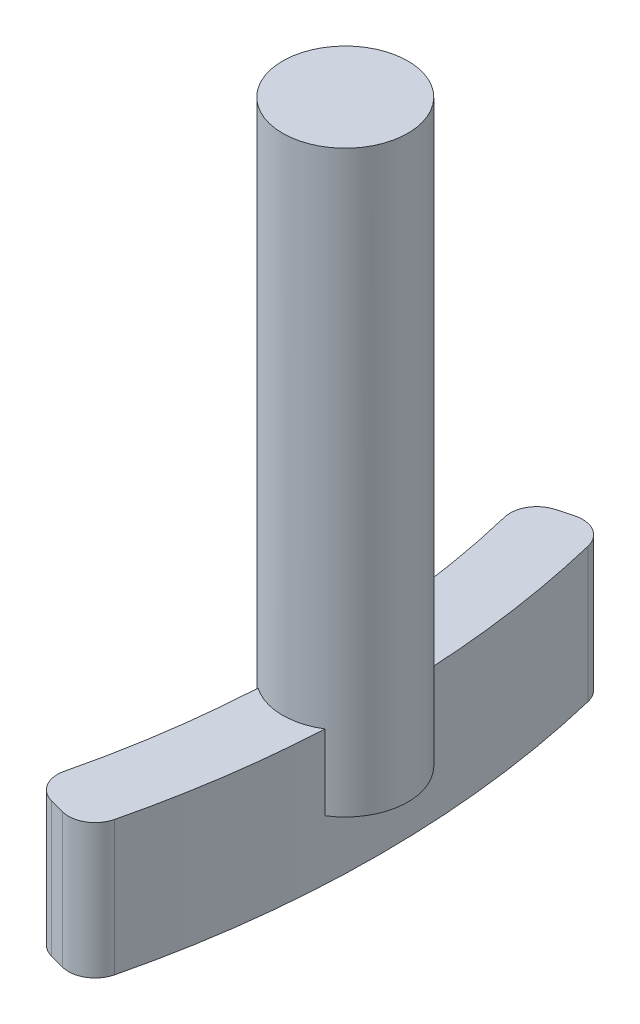
ISO-10303-21;
HEADER;
FILE_DESCRIPTION(('STEP AP214'),'2;1');
FILE_NAME('part.step','',(''),(''),'','','');
FILE_SCHEMA(('AUTOMOTIVE_DESIGN { 1 0 10303 214 1 1 1 1 }'));
ENDSEC;
DATA;
#1=APPLICATION_CONTEXT('core data for automotive mechanical design processes');
#2=APPLICATION_PROTOCOL_DEFINITION('international standard','automotive_design',2000,#1);
#3=PRODUCT_CONTEXT('',#1,'mechanical');
#4=PRODUCT('Part','Part','',(#3));
#5=PRODUCT_RELATED_PRODUCT_CATEGORY('part','',(#4));
#6=PRODUCT_DEFINITION_FORMATION('','',#4);
#7=PRODUCT_DEFINITION_CONTEXT('part definition',#1,'design');
#8=PRODUCT_DEFINITION('design','',#6,#7);
#9=PRODUCT_DEFINITION_SHAPE('','',#8);
#10=(LENGTH_UNIT() NAMED_UNIT(*) SI_UNIT(.MILLI.,.METRE.));
#11=(NAMED_UNIT(*) PLANE_ANGLE_UNIT() SI_UNIT($,.RADIAN.));
#12=(NAMED_UNIT(*) SI_UNIT($,.STERADIAN.) SOLID_ANGLE_UNIT());
#13=UNCERTAINTY_MEASURE_WITH_UNIT(LENGTH_MEASURE(1.E-05),#10,'distance_accuracy_value','');
#14=(GEOMETRIC_REPRESENTATION_CONTEXT(3) GLOBAL_UNCERTAINTY_ASSIGNED_CONTEXT((#13)) GLOBAL_UNIT_ASSIGNED_CONTEXT((#10,
#11,#12)) REPRESENTATION_CONTEXT('',''));
#15=CARTESIAN_POINT('',(0.,0.,0.));
#16=DIRECTION('',(0.,0.,1.));
#17=DIRECTION('',(1.,0.,0.));
#18=AXIS2_PLACEMENT_3D('',#15,#16,#17);
#19=CARTESIAN_POINT('',(-30.5687487202427,4.3,-6.82173660494919E-13));
#20=DIRECTION('',(0.,-1.,0.));
#21=DIRECTION('',(0.,0.,-1.));
#22=AXIS2_PLACEMENT_3D('',#19,#20,#21);
#23=CYLINDRICAL_SURFACE('',#22,32.0999999999997);
#24=DIRECTION('',(0.,-1.,0.));
#25=VECTOR('',#24,1.);
#26=CARTESIAN_POINT('',(1.48625127975695,11.15,1.69911006117922));
#27=LINE('',#26,#25);
#28=CARTESIAN_POINT('',(1.4862512797569,4.3,1.69911006117915));
#29=VERTEX_POINT('',#28);
#30=CARTESIAN_POINT('',(1.48625127975689,1.9,1.69911006117926));
#31=VERTEX_POINT('',#30);
#32=EDGE_CURVE('E201',#29,#31,#27,.T.);
#33=ORIENTED_EDGE('',*,*,#32,.F.);
#34=CARTESIAN_POINT('',(-30.5687487202427,4.3,-6.82173660494919E-13));
#35=DIRECTION('',(0.,1.,0.));
#36=DIRECTION('',(0.,0.,1.));
#37=AXIS2_PLACEMENT_3D('',#34,#35,#36);
#38=CIRCLE('',#37,32.0999999999997);
#39=CARTESIAN_POINT('',(0.627933418644134,4.3,7.56154901625497));
#40=VERTEX_POINT('',#39);
#41=EDGE_CURVE('E190',#40,#29,#38,.T.);
#42=ORIENTED_EDGE('',*,*,#41,.F.);
#43=DIRECTION('',(0.,-1.,0.));
#44=VECTOR('',#43,1.);
#45=CARTESIAN_POINT('',(0.627933418644134,4.3,7.56154901625497));
#46=LINE('',#45,#44);
#47=CARTESIAN_POINT('',(0.627933418644134,0.,7.56154901625497));
#48=VERTEX_POINT('',#47);
#49=EDGE_CURVE('E151',#40,#48,#46,.T.);
#50=ORIENTED_EDGE('',*,*,#49,.T.);
#51=CARTESIAN_POINT('',(-30.5687487202427,0.,-6.82173660494919E-13));
#52=DIRECTION('',(0.,1.,0.));
#53=DIRECTION('',(0.,0.,1.));
#54=AXIS2_PLACEMENT_3D('',#51,#52,#53);
#55=CIRCLE('',#54,32.0999999999997);
#56=CARTESIAN_POINT('',(0.627933418643905,0.,-7.56154901625722));
#57=VERTEX_POINT('',#56);
#58=EDGE_CURVE('E176',#48,#57,#55,.T.);
#59=ORIENTED_EDGE('',*,*,#58,.T.);
#60=DIRECTION('',(0.,-1.,0.));
#61=VECTOR('',#60,1.);
#62=CARTESIAN_POINT('',(0.627933418643905,4.3,-7.56154901625722));
#63=LINE('',#62,#61);
#64=CARTESIAN_POINT('',(0.627933418643905,4.3,-7.56154901625722));
#65=VERTEX_POINT('',#64);
#66=EDGE_CURVE('E154',#65,#57,#63,.T.);
#67=ORIENTED_EDGE('',*,*,#66,.F.);
#68=CARTESIAN_POINT('',(1.48625127975698,4.3,-1.6991100611791));
#69=VERTEX_POINT('',#68);
#70=EDGE_CURVE('E193',#69,#65,#38,.T.);
#71=ORIENTED_EDGE('',*,*,#70,.F.);
#72=DIRECTION('',(0.,-1.,0.));
#73=VECTOR('',#72,1.);
#74=CARTESIAN_POINT('',(1.48625127975702,11.15,-1.69911006117918));
#75=LINE('',#74,#73);
#76=CARTESIAN_POINT('',(1.48625127975697,1.9,-1.69911006117921));
#77=VERTEX_POINT('',#76);
#78=EDGE_CURVE('E48',#77,#69,#75,.F.);
#79=ORIENTED_EDGE('',*,*,#78,.F.);
#80=CARTESIAN_POINT('',(-30.5687487202427,1.9,-6.82173660494919E-13));
#81=DIRECTION('',(0.,1.,0.));
#82=DIRECTION('',(0.,0.,1.));
#83=AXIS2_PLACEMENT_3D('',#80,#81,#82);
#84=CIRCLE('',#83,32.0999999999997);
#85=EDGE_CURVE('E52',#31,#77,#84,.T.);
#86=ORIENTED_EDGE('',*,*,#85,.F.);
#87=EDGE_LOOP('',(#33,#42,#50,#59,#67,#71,#79,#86));
#88=FACE_BOUND('',#87,.T.);
#89=ADVANCED_FACE('F33',(#88),#23,.T.);
#90=CARTESIAN_POINT('',(-30.5687487202427,4.3,-6.82173660494919E-13));
#91=DIRECTION('',(0.,-1.,0.));
#92=DIRECTION('',(0.,0.,-1.));
#93=AXIS2_PLACEMENT_3D('',#90,#91,#92);
#94=CYLINDRICAL_SURFACE('',#93,29.8999999999998);
#95=DIRECTION('',(0.,-1.,0.));
#96=VECTOR('',#95,1.);
#97=CARTESIAN_POINT('',(-0.713748720242946,11.15,1.63980944014838));
#98=LINE('',#97,#96);
#99=CARTESIAN_POINT('',(-0.713748720242945,1.9,1.63980944014838));
#100=VERTEX_POINT('',#99);
#101=CARTESIAN_POINT('',(-0.713748720242945,4.3,1.63980944014838));
#102=VERTEX_POINT('',#101);
#103=EDGE_CURVE('E203',#100,#102,#98,.F.);
#104=ORIENTED_EDGE('',*,*,#103,.F.);
#105=CARTESIAN_POINT('',(-30.5687487202427,1.9,-6.82173660494919E-13));
#106=DIRECTION('',(0.,1.,0.));
#107=DIRECTION('',(0.,0.,1.));
#108=AXIS2_PLACEMENT_3D('',#105,#106,#107);
#109=CIRCLE('',#108,29.8999999999998);
#110=CARTESIAN_POINT('',(-0.713748720242873,1.9,-1.63980944014843));
#111=VERTEX_POINT('',#110);
#112=EDGE_CURVE('E11',#111,#100,#109,.F.);
#113=ORIENTED_EDGE('',*,*,#112,.F.);
#114=DIRECTION('',(0.,-1.,0.));
#115=VECTOR('',#114,1.);
#116=CARTESIAN_POINT('',(-0.713748720242871,11.15,-1.63980944014843));
#117=LINE('',#116,#115);
#118=CARTESIAN_POINT('',(-0.713748720242869,4.3,-1.63980944014843));
#119=VERTEX_POINT('',#118);
#120=EDGE_CURVE('E134',#119,#111,#117,.T.);
#121=ORIENTED_EDGE('',*,*,#120,.F.);
#122=CARTESIAN_POINT('',(-30.5687487202427,4.3,-6.82173660494919E-13));
#123=DIRECTION('',(0.,-1.,0.));
#124=DIRECTION('',(0.,0.,1.));
#125=AXIS2_PLACEMENT_3D('',#122,#123,#124);
#126=CIRCLE('',#125,29.8999999999998);
#127=CARTESIAN_POINT('',(-1.50740974559166,4.3,-7.03196821668193));
#128=VERTEX_POINT('',#127);
#129=EDGE_CURVE('E120',#128,#119,#126,.T.);
#130=ORIENTED_EDGE('',*,*,#129,.F.);
#131=DIRECTION('',(0.,-1.,0.));
#132=VECTOR('',#131,1.);
#133=CARTESIAN_POINT('',(-1.50740974559166,4.3,-7.03196821668193));
#134=LINE('',#133,#132);
#135=CARTESIAN_POINT('',(-1.50740974559166,0.,-7.03196821668193));
#136=VERTEX_POINT('',#135);
#137=EDGE_CURVE('E163',#128,#136,#134,.T.);
#138=ORIENTED_EDGE('',*,*,#137,.T.);
#139=CARTESIAN_POINT('',(-30.5687487202427,0.,-6.82173660494919E-13));
#140=DIRECTION('',(0.,-1.,0.));
#141=DIRECTION('',(0.,0.,1.));
#142=AXIS2_PLACEMENT_3D('',#139,#140,#141);
#143=CIRCLE('',#142,29.8999999999998);
#144=CARTESIAN_POINT('',(-1.50740974559173,0.,7.03196821668091));
#145=VERTEX_POINT('',#144);
#146=EDGE_CURVE('E167',#136,#145,#143,.T.);
#147=ORIENTED_EDGE('',*,*,#146,.T.);
#148=DIRECTION('',(0.,-1.,0.));
#149=VECTOR('',#148,1.);
#150=CARTESIAN_POINT('',(-1.50740974559173,4.3,7.03196821668091));
#151=LINE('',#150,#149);
#152=CARTESIAN_POINT('',(-1.50740974559173,4.3,7.03196821668091));
#153=VERTEX_POINT('',#152);
#154=EDGE_CURVE('E130',#153,#145,#151,.T.);
#155=ORIENTED_EDGE('',*,*,#154,.F.);
#156=EDGE_CURVE('E131',#102,#153,#126,.T.);
#157=ORIENTED_EDGE('',*,*,#156,.F.);
#158=EDGE_LOOP('',(#104,#113,#121,#130,#138,#147,#155,#157));
#159=FACE_BOUND('',#158,.T.);
#160=ADVANCED_FACE('F135',(#159),#94,.F.);
#161=CARTESIAN_POINT('',(-0.681251279757298,4.3,7.23187366765677));
#162=DIRECTION('',(0.,-1.,0.));
#163=DIRECTION('',(0.,0.,-1.));
#164=AXIS2_PLACEMENT_3D('',#161,#162,#163);
#165=PLANE('',#164);
#166=CARTESIAN_POINT('',(0.431251279757166,4.3,0.));
#167=DIRECTION('',(0.,-1.,0.));
#168=DIRECTION('',(0.,0.,-1.));
#169=AXIS2_PLACEMENT_3D('',#166,#167,#168);
#170=CIRCLE('',#169,2.);
#171=EDGE_CURVE('E41',#102,#29,#170,.F.);
#172=ORIENTED_EDGE('',*,*,#171,.F.);
#173=ORIENTED_EDGE('',*,*,#156,.T.);
#174=CARTESIAN_POINT('',(-0.681251279757298,4.3,7.23187366765677));
#175=DIRECTION('',(0.,1.,0.));
#176=DIRECTION('',(0.,0.,-1.));
#177=AXIS2_PLACEMENT_3D('',#174,#175,#176);
#178=CIRCLE('',#177,0.849999999999792);
#179=CARTESIAN_POINT('',(-0.901247468094085,4.3,8.0529106200023));
#180=VERTEX_POINT('',#179);
#181=EDGE_CURVE('E169',#153,#180,#178,.T.);
#182=ORIENTED_EDGE('',*,*,#181,.T.);
#183=DIRECTION('',(0.965925826289131,0.,0.258819045102288));
#184=VECTOR('',#183,1.);
#185=CARTESIAN_POINT('',(-0.901247468094085,4.3,8.0529106200023));
#186=LINE('',#185,#184);
#187=CARTESIAN_POINT('',(-0.418143137857351,4.3,8.18235803514908));
#188=VERTEX_POINT('',#187);
#189=EDGE_CURVE('E196',#180,#188,#186,.T.);
#190=ORIENTED_EDGE('',*,*,#189,.T.);
#191=CARTESIAN_POINT('',(-0.198146949520289,4.3,7.36132108280253));
#192=DIRECTION('',(0.,1.,0.));
#193=DIRECTION('',(0.,0.,-1.));
#194=AXIS2_PLACEMENT_3D('',#191,#192,#193);
#195=CIRCLE('',#194,0.850000000000766);
#196=EDGE_CURVE('E194',#188,#40,#195,.T.);
#197=ORIENTED_EDGE('',*,*,#196,.T.);
#198=ORIENTED_EDGE('',*,*,#41,.T.);
#199=EDGE_LOOP('',(#172,#173,#182,#190,#197,#198));
#200=FACE_BOUND('',#199,.T.);
#201=ADVANCED_FACE('F232',(#200),#165,.F.);
#202=CARTESIAN_POINT('',(-0.681251279757298,4.3,7.23187366765677));
#203=DIRECTION('',(0.,-1.,0.));
#204=DIRECTION('',(0.,0.,-1.));
#205=AXIS2_PLACEMENT_3D('',#202,#203,#204);
#206=CYLINDRICAL_SURFACE('',#205,0.849999999999792);
#207=CARTESIAN_POINT('',(-0.681251279757298,0.,7.23187366765677));
#208=DIRECTION('',(0.,1.,0.));
#209=DIRECTION('',(0.,0.,-1.));
#210=AXIS2_PLACEMENT_3D('',#207,#208,#209);
#211=CIRCLE('',#210,0.849999999999792);
#212=CARTESIAN_POINT('',(-0.901247468094085,0.,8.0529106200023));
#213=VERTEX_POINT('',#212);
#214=EDGE_CURVE('E182',#145,#213,#211,.T.);
#215=ORIENTED_EDGE('',*,*,#214,.T.);
#216=DIRECTION('',(0.,-1.,0.));
#217=VECTOR('',#216,1.);
#218=CARTESIAN_POINT('',(-0.901247468094085,4.3,8.0529106200023));
#219=LINE('',#218,#217);
#220=EDGE_CURVE('E144',#180,#213,#219,.T.);
#221=ORIENTED_EDGE('',*,*,#220,.F.);
#222=ORIENTED_EDGE('',*,*,#181,.F.);
#223=ORIENTED_EDGE('',*,*,#154,.T.);
#224=EDGE_LOOP('',(#215,#221,#222,#223));
#225=FACE_BOUND('',#224,.T.);
#226=ADVANCED_FACE('F35',(#225),#206,.T.);
#227=CARTESIAN_POINT('',(-0.901247468094085,4.3,8.0529106200023));
#228=DIRECTION('',(0.258819045102288,0.,-0.965925826289131));
#229=DIRECTION('',(-0.965925826289131,0.,-0.258819045102288));
#230=AXIS2_PLACEMENT_3D('',#227,#228,#229);
#231=PLANE('',#230);
#232=DIRECTION('',(0.965925826289131,0.,0.258819045102288));
#233=VECTOR('',#232,1.);
#234=CARTESIAN_POINT('',(-0.901247468094085,0.,8.0529106200023));
#235=LINE('',#234,#233);
#236=CARTESIAN_POINT('',(-0.418143137857351,0.,8.18235803514908));
#237=VERTEX_POINT('',#236);
#238=EDGE_CURVE('E180',#213,#237,#235,.T.);
#239=ORIENTED_EDGE('',*,*,#238,.T.);
#240=DIRECTION('',(0.,-1.,0.));
#241=VECTOR('',#240,1.);
#242=CARTESIAN_POINT('',(-0.418143137857351,4.3,8.18235803514908));
#243=LINE('',#242,#241);
#244=EDGE_CURVE('E146',#188,#237,#243,.T.);
#245=ORIENTED_EDGE('',*,*,#244,.F.);
#246=ORIENTED_EDGE('',*,*,#189,.F.);
#247=ORIENTED_EDGE('',*,*,#220,.T.);
#248=EDGE_LOOP('',(#239,#245,#246,#247));
#249=FACE_BOUND('',#248,.T.);
#250=ADVANCED_FACE('F240',(#249),#231,.F.);
#251=CARTESIAN_POINT('',(-0.198146949520289,4.3,7.36132108280253));
#252=DIRECTION('',(0.,-1.,0.));
#253=DIRECTION('',(0.,0.,-1.));
#254=AXIS2_PLACEMENT_3D('',#251,#252,#253);
#255=CYLINDRICAL_SURFACE('',#254,0.850000000000766);
#256=CARTESIAN_POINT('',(-0.198146949520289,0.,7.36132108280253));
#257=DIRECTION('',(0.,1.,0.));
#258=DIRECTION('',(0.,0.,-1.));
#259=AXIS2_PLACEMENT_3D('',#256,#257,#258);
#260=CIRCLE('',#259,0.850000000000766);
#261=EDGE_CURVE('E178',#237,#48,#260,.T.);
#262=ORIENTED_EDGE('',*,*,#261,.T.);
#263=ORIENTED_EDGE('',*,*,#49,.F.);
#264=ORIENTED_EDGE('',*,*,#196,.F.);
#265=ORIENTED_EDGE('',*,*,#244,.T.);
#266=EDGE_LOOP('',(#262,#263,#264,#265));
#267=FACE_BOUND('',#266,.T.);
#268=ADVANCED_FACE('F238',(#267),#255,.T.);
#269=CARTESIAN_POINT('',(-0.198146949519636,4.3,-7.36132108280495));
#270=DIRECTION('',(0.,-1.,0.));
#271=DIRECTION('',(0.,0.,-1.));
#272=AXIS2_PLACEMENT_3D('',#269,#270,#271);
#273=CYLINDRICAL_SURFACE('',#272,0.8499999999999);
#274=CARTESIAN_POINT('',(-0.198146949519636,0.,-7.36132108280495));
#275=DIRECTION('',(0.,1.,0.));
#276=DIRECTION('',(0.,0.,-1.));
#277=AXIS2_PLACEMENT_3D('',#274,#275,#276);
#278=CIRCLE('',#277,0.8499999999999);
#279=CARTESIAN_POINT('',(-0.418143137856753,0.,-8.18235803515056));
#280=VERTEX_POINT('',#279);
#281=EDGE_CURVE('E174',#57,#280,#278,.T.);
#282=ORIENTED_EDGE('',*,*,#281,.T.);
#283=DIRECTION('',(0.,-1.,0.));
#284=VECTOR('',#283,1.);
#285=CARTESIAN_POINT('',(-0.418143137856753,4.3,-8.18235803515056));
#286=LINE('',#285,#284);
#287=CARTESIAN_POINT('',(-0.418143137856753,4.3,-8.18235803515056));
#288=VERTEX_POINT('',#287);
#289=EDGE_CURVE('E157',#288,#280,#286,.T.);
#290=ORIENTED_EDGE('',*,*,#289,.F.);
#291=CARTESIAN_POINT('',(-0.198146949519636,4.3,-7.36132108280495));
#292=DIRECTION('',(0.,1.,0.));
#293=DIRECTION('',(0.,0.,-1.));
#294=AXIS2_PLACEMENT_3D('',#291,#292,#293);
#295=CIRCLE('',#294,0.8499999999999);
#296=EDGE_CURVE('E188',#65,#288,#295,.T.);
#297=ORIENTED_EDGE('',*,*,#296,.F.);
#298=ORIENTED_EDGE('',*,*,#66,.T.);
#299=EDGE_LOOP('',(#282,#290,#297,#298));
#300=FACE_BOUND('',#299,.T.);
#301=ADVANCED_FACE('F236',(#300),#273,.T.);
#302=CARTESIAN_POINT('',(-0.901247468094234,4.3,-8.05291062000355));
#303=DIRECTION('',(0.258819045102377,0.,0.965925826289107));
#304=DIRECTION('',(0.965925826289107,0.,-0.258819045102377));
#305=AXIS2_PLACEMENT_3D('',#302,#303,#304);
#306=PLANE('',#305);
#307=DIRECTION('',(-0.965925826289107,0.,0.258819045102377));
#308=VECTOR('',#307,1.);
#309=CARTESIAN_POINT('',(-0.901247468094234,0.,-8.05291062000355));
#310=LINE('',#309,#308);
#311=CARTESIAN_POINT('',(-0.901247468094234,0.,-8.05291062000355));
#312=VERTEX_POINT('',#311);
#313=EDGE_CURVE('E172',#280,#312,#310,.T.);
#314=ORIENTED_EDGE('',*,*,#313,.T.);
#315=DIRECTION('',(0.,-1.,0.));
#316=VECTOR('',#315,1.);
#317=CARTESIAN_POINT('',(-0.901247468094234,4.3,-8.05291062000355));
#318=LINE('',#317,#316);
#319=CARTESIAN_POINT('',(-0.901247468094234,4.3,-8.05291062000355));
#320=VERTEX_POINT('',#319);
#321=EDGE_CURVE('E160',#320,#312,#318,.T.);
#322=ORIENTED_EDGE('',*,*,#321,.F.);
#323=DIRECTION('',(-0.965925826289107,0.,0.258819045102377));
#324=VECTOR('',#323,1.);
#325=CARTESIAN_POINT('',(-0.901247468094234,4.3,-8.05291062000355));
#326=LINE('',#325,#324);
#327=EDGE_CURVE('E186',#288,#320,#326,.T.);
#328=ORIENTED_EDGE('',*,*,#327,.F.);
#329=ORIENTED_EDGE('',*,*,#289,.T.);
#330=EDGE_LOOP('',(#314,#322,#328,#329));
#331=FACE_BOUND('',#330,.T.);
#332=ADVANCED_FACE('F267',(#331),#306,.F.);
#333=CARTESIAN_POINT('',(-0.681251279757095,4.3,-7.23187366765784));
#334=DIRECTION('',(0.,-1.,0.));
#335=DIRECTION('',(0.,0.,-1.));
#336=AXIS2_PLACEMENT_3D('',#333,#334,#335);
#337=CYLINDRICAL_SURFACE('',#336,0.850000000000002);
#338=CARTESIAN_POINT('',(-0.681251279757095,0.,-7.23187366765784));
#339=DIRECTION('',(0.,1.,0.));
#340=DIRECTION('',(0.,0.,1.));
#341=AXIS2_PLACEMENT_3D('',#338,#339,#340);
#342=CIRCLE('',#341,0.850000000000002);
#343=EDGE_CURVE('E170',#312,#136,#342,.T.);
#344=ORIENTED_EDGE('',*,*,#343,.T.);
#345=ORIENTED_EDGE('',*,*,#137,.F.);
#346=CARTESIAN_POINT('',(-0.681251279757095,4.3,-7.23187366765784));
#347=DIRECTION('',(0.,1.,0.));
#348=DIRECTION('',(0.,0.,1.));
#349=AXIS2_PLACEMENT_3D('',#346,#347,#348);
#350=CIRCLE('',#349,0.850000000000002);
#351=EDGE_CURVE('E126',#320,#128,#350,.T.);
#352=ORIENTED_EDGE('',*,*,#351,.F.);
#353=ORIENTED_EDGE('',*,*,#321,.T.);
#354=EDGE_LOOP('',(#344,#345,#352,#353));
#355=FACE_BOUND('',#354,.T.);
#356=ADVANCED_FACE('F270',(#355),#337,.T.);
#357=EDGE_CURVE('E124',#69,#119,#170,.F.);
#358=ORIENTED_EDGE('',*,*,#357,.F.);
#359=ORIENTED_EDGE('',*,*,#70,.T.);
#360=ORIENTED_EDGE('',*,*,#296,.T.);
#361=ORIENTED_EDGE('',*,*,#327,.T.);
#362=ORIENTED_EDGE('',*,*,#351,.T.);
#363=ORIENTED_EDGE('',*,*,#129,.T.);
#364=EDGE_LOOP('',(#358,#359,#360,#361,#362,#363));
#365=FACE_BOUND('',#364,.T.);
#366=ADVANCED_FACE('F122',(#365),#165,.F.);
#367=CARTESIAN_POINT('',(-0.681251279757298,0.,7.23187366765677));
#368=DIRECTION('',(0.,-1.,0.));
#369=DIRECTION('',(0.,0.,-1.));
#370=AXIS2_PLACEMENT_3D('',#367,#368,#369);
#371=PLANE('',#370);
#372=ORIENTED_EDGE('',*,*,#214,.F.);
#373=ORIENTED_EDGE('',*,*,#146,.F.);
#374=ORIENTED_EDGE('',*,*,#343,.F.);
#375=ORIENTED_EDGE('',*,*,#313,.F.);
#376=ORIENTED_EDGE('',*,*,#281,.F.);
#377=ORIENTED_EDGE('',*,*,#58,.F.);
#378=ORIENTED_EDGE('',*,*,#261,.F.);
#379=ORIENTED_EDGE('',*,*,#238,.F.);
#380=EDGE_LOOP('',(#372,#373,#374,#375,#376,#377,#378,#379));
#381=FACE_BOUND('',#380,.T.);
#382=ADVANCED_FACE('F256',(#381),#371,.T.);
#383=CARTESIAN_POINT('',(0.431251279757166,1.9,0.));
#384=DIRECTION('',(0.,1.,0.));
#385=DIRECTION('',(0.,0.,1.));
#386=AXIS2_PLACEMENT_3D('',#383,#384,#385);
#387=PLANE('',#386);
#388=CARTESIAN_POINT('',(0.431251279757166,1.9,0.));
#389=DIRECTION('',(0.,1.,0.));
#390=DIRECTION('',(0.,0.,1.));
#391=AXIS2_PLACEMENT_3D('',#388,#389,#390);
#392=CIRCLE('',#391,2.);
#393=EDGE_CURVE('E207',#31,#77,#392,.T.);
#394=ORIENTED_EDGE('',*,*,#393,.F.);
#395=ORIENTED_EDGE('',*,*,#85,.T.);
#396=EDGE_LOOP('',(#394,#395));
#397=FACE_BOUND('',#396,.T.);
#398=ADVANCED_FACE('F223',(#397),#387,.F.);
#399=EDGE_CURVE('E209',#111,#100,#392,.T.);
#400=ORIENTED_EDGE('',*,*,#399,.F.);
#401=ORIENTED_EDGE('',*,*,#112,.T.);
#402=EDGE_LOOP('',(#400,#401));
#403=FACE_BOUND('',#402,.T.);
#404=ADVANCED_FACE('F216',(#403),#387,.F.);
#405=CARTESIAN_POINT('',(0.431251279757166,20.4,0.));
#406=DIRECTION('',(0.,-1.,0.));
#407=DIRECTION('',(0.,0.,-1.));
#408=AXIS2_PLACEMENT_3D('',#405,#406,#407);
#409=CYLINDRICAL_SURFACE('',#408,2.);
#410=CARTESIAN_POINT('',(0.431251279757166,20.4,0.));
#411=DIRECTION('',(0.,1.,0.));
#412=DIRECTION('',(0.,0.,1.));
#413=AXIS2_PLACEMENT_3D('',#410,#411,#412);
#414=CIRCLE('',#413,2.);
#415=CARTESIAN_POINT('',(0.431251279757166,20.4,2.));
#416=VERTEX_POINT('',#415);
#417=EDGE_CURVE('E139',#416,#416,#414,.T.);
#418=ORIENTED_EDGE('',*,*,#417,.F.);
#419=EDGE_LOOP('',(#418));
#420=FACE_BOUND('',#419,.T.);
#421=ORIENTED_EDGE('',*,*,#171,.T.);
#422=ORIENTED_EDGE('',*,*,#32,.T.);
#423=ORIENTED_EDGE('',*,*,#393,.T.);
#424=ORIENTED_EDGE('',*,*,#78,.T.);
#425=ORIENTED_EDGE('',*,*,#357,.T.);
#426=ORIENTED_EDGE('',*,*,#120,.T.);
#427=ORIENTED_EDGE('',*,*,#399,.T.);
#428=ORIENTED_EDGE('',*,*,#103,.T.);
#429=EDGE_LOOP('',(#421,#422,#423,#424,#425,#426,#427,#428));
#430=FACE_BOUND('',#429,.T.);
#431=ADVANCED_FACE('F142',(#420,#430),#409,.T.);
#432=CARTESIAN_POINT('',(0.431251279757166,20.4,0.));
#433=DIRECTION('',(0.,1.,0.));
#434=DIRECTION('',(0.,0.,1.));
#435=AXIS2_PLACEMENT_3D('',#432,#433,#434);
#436=PLANE('',#435);
#437=ORIENTED_EDGE('',*,*,#417,.T.);
#438=EDGE_LOOP('',(#437));
#439=FACE_BOUND('',#438,.T.);
#440=ADVANCED_FACE('F213',(#439),#436,.T.);
#441=CLOSED_SHELL('',(#89,#160,#201,#226,#250,#268,#301,#332,#356,#366,#382,#398,#404,#431,#440));
#442=MANIFOLD_SOLID_BREP('B2',#441);
#443=ADVANCED_BREP_SHAPE_REPRESENTATION('',(#18,#442),#14);
#444=SHAPE_DEFINITION_REPRESENTATION(#9,#443);
ENDSEC;
END-ISO-10303-21;
